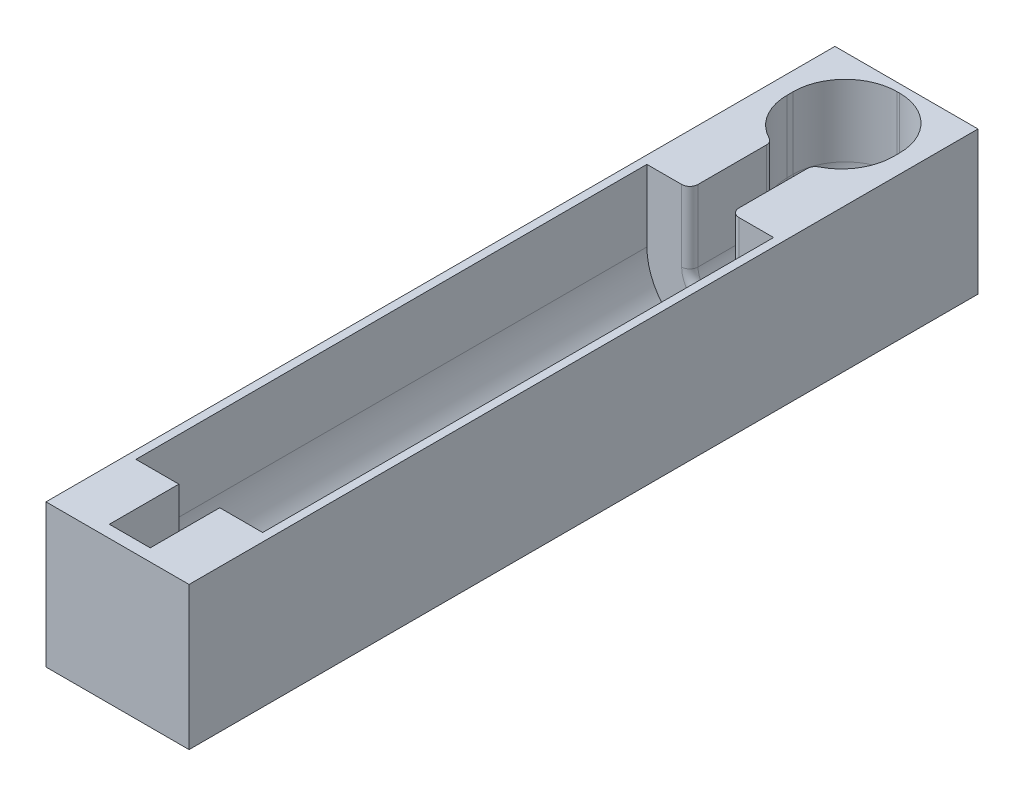
ISO-10303-21;
HEADER;
FILE_DESCRIPTION(('STEP AP214'),'2;1');
FILE_NAME('part.step','',(''),(''),'','','');
FILE_SCHEMA(('AUTOMOTIVE_DESIGN { 1 0 10303 214 1 1 1 1 }'));
ENDSEC;
DATA;
#1=APPLICATION_CONTEXT('core data for automotive mechanical design processes');
#2=APPLICATION_PROTOCOL_DEFINITION('international standard','automotive_design',2000,#1);
#3=PRODUCT_CONTEXT('',#1,'mechanical');
#4=PRODUCT('Part','Part','',(#3));
#5=PRODUCT_RELATED_PRODUCT_CATEGORY('part','',(#4));
#6=PRODUCT_DEFINITION_FORMATION('','',#4);
#7=PRODUCT_DEFINITION_CONTEXT('part definition',#1,'design');
#8=PRODUCT_DEFINITION('design','',#6,#7);
#9=PRODUCT_DEFINITION_SHAPE('','',#8);
#10=(LENGTH_UNIT() NAMED_UNIT(*) SI_UNIT(.MILLI.,.METRE.));
#11=(NAMED_UNIT(*) PLANE_ANGLE_UNIT() SI_UNIT($,.RADIAN.));
#12=(NAMED_UNIT(*) SI_UNIT($,.STERADIAN.) SOLID_ANGLE_UNIT());
#13=UNCERTAINTY_MEASURE_WITH_UNIT(LENGTH_MEASURE(1.E-05),#10,'distance_accuracy_value','');
#14=(GEOMETRIC_REPRESENTATION_CONTEXT(3) GLOBAL_UNCERTAINTY_ASSIGNED_CONTEXT((#13)) GLOBAL_UNIT_ASSIGNED_CONTEXT((#10,
#11,#12)) REPRESENTATION_CONTEXT('',''));
#15=CARTESIAN_POINT('',(0.,0.,0.));
#16=DIRECTION('',(0.,0.,1.));
#17=DIRECTION('',(1.,0.,0.));
#18=AXIS2_PLACEMENT_3D('',#15,#16,#17);
#19=CARTESIAN_POINT('',(15.5,0.,125.));
#20=DIRECTION('',(1.,0.,0.));
#21=DIRECTION('',(0.,0.,-1.));
#22=AXIS2_PLACEMENT_3D('',#19,#20,#21);
#23=PLANE('',#22);
#24=DIRECTION('',(0.,-1.,0.));
#25=VECTOR('',#24,1.);
#26=CARTESIAN_POINT('',(15.5,0.,0.));
#27=LINE('',#26,#25);
#28=CARTESIAN_POINT('',(15.5,17.5,0.));
#29=VERTEX_POINT('',#28);
#30=CARTESIAN_POINT('',(15.5,0.,0.));
#31=VERTEX_POINT('',#30);
#32=EDGE_CURVE('E326',#29,#31,#27,.T.);
#33=ORIENTED_EDGE('',*,*,#32,.T.);
#34=DIRECTION('',(0.,0.,-1.));
#35=VECTOR('',#34,1.);
#36=CARTESIAN_POINT('',(15.5,0.,125.));
#37=LINE('',#36,#35);
#38=CARTESIAN_POINT('',(15.5,0.,125.));
#39=VERTEX_POINT('',#38);
#40=EDGE_CURVE('E368',#39,#31,#37,.T.);
#41=ORIENTED_EDGE('',*,*,#40,.F.);
#42=DIRECTION('',(0.,-1.,0.));
#43=VECTOR('',#42,1.);
#44=CARTESIAN_POINT('',(15.5,0.,125.));
#45=LINE('',#44,#43);
#46=CARTESIAN_POINT('',(15.5,17.5,125.));
#47=VERTEX_POINT('',#46);
#48=EDGE_CURVE('E330',#47,#39,#45,.T.);
#49=ORIENTED_EDGE('',*,*,#48,.F.);
#50=DIRECTION('',(0.,0.,-1.));
#51=VECTOR('',#50,1.);
#52=CARTESIAN_POINT('',(15.5,17.5,125.));
#53=LINE('',#52,#51);
#54=EDGE_CURVE('E372',#47,#29,#53,.T.);
#55=ORIENTED_EDGE('',*,*,#54,.T.);
#56=EDGE_LOOP('',(#33,#41,#49,#55));
#57=FACE_BOUND('',#56,.T.);
#58=ADVANCED_FACE('F48',(#57),#23,.F.);
#59=CARTESIAN_POINT('',(0.,0.,125.));
#60=DIRECTION('',(0.,0.,-1.));
#61=DIRECTION('',(-1.,0.,0.));
#62=AXIS2_PLACEMENT_3D('',#59,#60,#61);
#63=CYLINDRICAL_SURFACE('',#62,15.5);
#64=CARTESIAN_POINT('',(0.,0.,0.));
#65=DIRECTION('',(0.,0.,-1.));
#66=DIRECTION('',(1.,0.,0.));
#67=AXIS2_PLACEMENT_3D('',#64,#65,#66);
#68=CIRCLE('',#67,15.5);
#69=CARTESIAN_POINT('',(-15.5,0.,0.));
#70=VERTEX_POINT('',#69);
#71=EDGE_CURVE('E346',#31,#70,#68,.T.);
#72=ORIENTED_EDGE('',*,*,#71,.T.);
#73=DIRECTION('',(0.,0.,-1.));
#74=VECTOR('',#73,1.);
#75=CARTESIAN_POINT('',(-15.5,0.,125.));
#76=LINE('',#75,#74);
#77=CARTESIAN_POINT('',(-15.5,0.,125.));
#78=VERTEX_POINT('',#77);
#79=EDGE_CURVE('E364',#78,#70,#76,.T.);
#80=ORIENTED_EDGE('',*,*,#79,.F.);
#81=CARTESIAN_POINT('',(0.,0.,125.));
#82=DIRECTION('',(0.,0.,-1.));
#83=DIRECTION('',(1.,0.,0.));
#84=AXIS2_PLACEMENT_3D('',#81,#82,#83);
#85=CIRCLE('',#84,15.5);
#86=EDGE_CURVE('E334',#39,#78,#85,.T.);
#87=ORIENTED_EDGE('',*,*,#86,.F.);
#88=ORIENTED_EDGE('',*,*,#40,.T.);
#89=EDGE_LOOP('',(#72,#80,#87,#88));
#90=FACE_BOUND('',#89,.T.);
#91=ADVANCED_FACE('F589',(#90),#63,.F.);
#92=CARTESIAN_POINT('',(-15.5,0.,125.));
#93=DIRECTION('',(-1.,0.,0.));
#94=DIRECTION('',(0.,0.,1.));
#95=AXIS2_PLACEMENT_3D('',#92,#93,#94);
#96=PLANE('',#95);
#97=DIRECTION('',(0.,1.,0.));
#98=VECTOR('',#97,1.);
#99=CARTESIAN_POINT('',(-15.5,0.,0.));
#100=LINE('',#99,#98);
#101=CARTESIAN_POINT('',(-15.5,17.5,0.));
#102=VERTEX_POINT('',#101);
#103=EDGE_CURVE('E335',#70,#102,#100,.T.);
#104=ORIENTED_EDGE('',*,*,#103,.T.);
#105=DIRECTION('',(0.,0.,-1.));
#106=VECTOR('',#105,1.);
#107=CARTESIAN_POINT('',(-15.5,17.5,125.));
#108=LINE('',#107,#106);
#109=CARTESIAN_POINT('',(-15.5,17.5,125.));
#110=VERTEX_POINT('',#109);
#111=EDGE_CURVE('E360',#110,#102,#108,.T.);
#112=ORIENTED_EDGE('',*,*,#111,.F.);
#113=DIRECTION('',(0.,1.,0.));
#114=VECTOR('',#113,1.);
#115=CARTESIAN_POINT('',(-15.5,0.,125.));
#116=LINE('',#115,#114);
#117=EDGE_CURVE('E339',#78,#110,#116,.T.);
#118=ORIENTED_EDGE('',*,*,#117,.F.);
#119=ORIENTED_EDGE('',*,*,#79,.T.);
#120=EDGE_LOOP('',(#104,#112,#118,#119));
#121=FACE_BOUND('',#120,.T.);
#122=ADVANCED_FACE('F587',(#121),#96,.F.);
#123=CARTESIAN_POINT('',(-17.5,17.5,125.));
#124=DIRECTION('',(0.,-1.,0.));
#125=DIRECTION('',(0.,0.,-1.));
#126=AXIS2_PLACEMENT_3D('',#123,#124,#125);
#127=PLANE('',#126);
#128=DIRECTION('',(0.,0.,1.));
#129=VECTOR('',#128,1.);
#130=CARTESIAN_POINT('',(5.,17.5,-20.));
#131=LINE('',#130,#129);
#132=CARTESIAN_POINT('',(5.,17.5,-18.7139631759652));
#133=VERTEX_POINT('',#132);
#134=CARTESIAN_POINT('',(5.,17.5,-2.));
#135=VERTEX_POINT('',#134);
#136=EDGE_CURVE('E528',#133,#135,#131,.T.);
#137=ORIENTED_EDGE('',*,*,#136,.T.);
#138=CARTESIAN_POINT('',(7.,17.5,-2.));
#139=DIRECTION('',(0.,-1.,0.));
#140=DIRECTION('',(0.,0.,-1.));
#141=AXIS2_PLACEMENT_3D('',#138,#139,#140);
#142=CIRCLE('',#141,2.);
#143=CARTESIAN_POINT('',(7.,17.5,0.));
#144=VERTEX_POINT('',#143);
#145=EDGE_CURVE('E462',#135,#144,#142,.F.);
#146=ORIENTED_EDGE('',*,*,#145,.T.);
#147=DIRECTION('',(1.,0.,0.));
#148=VECTOR('',#147,1.);
#149=CARTESIAN_POINT('',(17.5,17.5,0.));
#150=LINE('',#149,#148);
#151=EDGE_CURVE('E262',#144,#29,#150,.T.);
#152=ORIENTED_EDGE('',*,*,#151,.T.);
#153=ORIENTED_EDGE('',*,*,#54,.F.);
#154=DIRECTION('',(-1.,0.,0.));
#155=VECTOR('',#154,1.);
#156=CARTESIAN_POINT('',(-17.5,17.5,125.));
#157=LINE('',#156,#155);
#158=CARTESIAN_POINT('',(5.,17.5,125.));
#159=VERTEX_POINT('',#158);
#160=EDGE_CURVE('E317',#47,#159,#157,.T.);
#161=ORIENTED_EDGE('',*,*,#160,.T.);
#162=DIRECTION('',(0.,0.,-1.));
#163=VECTOR('',#162,1.);
#164=CARTESIAN_POINT('',(5.,17.5,142.));
#165=LINE('',#164,#163);
#166=CARTESIAN_POINT('',(5.,17.5,142.));
#167=VERTEX_POINT('',#166);
#168=EDGE_CURVE('E302',#167,#159,#165,.T.);
#169=ORIENTED_EDGE('',*,*,#168,.F.);
#170=DIRECTION('',(1.,0.,0.));
#171=VECTOR('',#170,1.);
#172=CARTESIAN_POINT('',(-5.,17.5,142.));
#173=LINE('',#172,#171);
#174=CARTESIAN_POINT('',(-5.,17.5,142.));
#175=VERTEX_POINT('',#174);
#176=EDGE_CURVE('E282',#175,#167,#173,.T.);
#177=ORIENTED_EDGE('',*,*,#176,.F.);
#178=DIRECTION('',(0.,0.,-1.));
#179=VECTOR('',#178,1.);
#180=CARTESIAN_POINT('',(-5.,17.5,142.));
#181=LINE('',#180,#179);
#182=CARTESIAN_POINT('',(-5.,17.5,125.));
#183=VERTEX_POINT('',#182);
#184=EDGE_CURVE('E305',#175,#183,#181,.T.);
#185=ORIENTED_EDGE('',*,*,#184,.T.);
#186=EDGE_CURVE('E301',#183,#110,#157,.T.);
#187=ORIENTED_EDGE('',*,*,#186,.T.);
#188=ORIENTED_EDGE('',*,*,#111,.T.);
#189=CARTESIAN_POINT('',(-7.,17.5,0.));
#190=VERTEX_POINT('',#189);
#191=EDGE_CURVE('E258',#102,#190,#150,.T.);
#192=ORIENTED_EDGE('',*,*,#191,.T.);
#193=CARTESIAN_POINT('',(-7.,17.5,-2.));
#194=DIRECTION('',(0.,-1.,0.));
#195=DIRECTION('',(0.,0.,-1.));
#196=AXIS2_PLACEMENT_3D('',#193,#194,#195);
#197=CIRCLE('',#196,2.);
#198=CARTESIAN_POINT('',(-5.,17.5,-2.));
#199=VERTEX_POINT('',#198);
#200=EDGE_CURVE('E456',#190,#199,#197,.F.);
#201=ORIENTED_EDGE('',*,*,#200,.T.);
#202=DIRECTION('',(0.,0.,1.));
#203=VECTOR('',#202,1.);
#204=CARTESIAN_POINT('',(-5.,17.5,-20.));
#205=LINE('',#204,#203);
#206=CARTESIAN_POINT('',(-5.,17.5,-18.7139631759652));
#207=VERTEX_POINT('',#206);
#208=EDGE_CURVE('E518',#207,#199,#205,.T.);
#209=ORIENTED_EDGE('',*,*,#208,.F.);
#210=CARTESIAN_POINT('',(-7.,17.5,-18.7139631759652));
#211=DIRECTION('',(0.,-1.,0.));
#212=DIRECTION('',(0.,0.,-1.));
#213=AXIS2_PLACEMENT_3D('',#210,#211,#212);
#214=CIRCLE('',#213,2.);
#215=CARTESIAN_POINT('',(-6.08843537414966,17.5,-20.4941457320246));
#216=VERTEX_POINT('',#215);
#217=EDGE_CURVE('E453',#207,#216,#214,.F.);
#218=ORIENTED_EDGE('',*,*,#217,.T.);
#219=CARTESIAN_POINT('',(-0.300000000000006,17.5,-31.7983049630021));
#220=DIRECTION('',(0.,-1.,0.));
#221=DIRECTION('',(0.,0.,-1.));
#222=AXIS2_PLACEMENT_3D('',#219,#220,#221);
#223=CIRCLE('',#222,12.7);
#224=CARTESIAN_POINT('',(-13.,17.5,-31.7983049630021));
#225=VERTEX_POINT('',#224);
#226=EDGE_CURVE('E424',#216,#225,#223,.T.);
#227=ORIENTED_EDGE('',*,*,#226,.T.);
#228=DIRECTION('',(0.,0.,-1.));
#229=VECTOR('',#228,1.);
#230=CARTESIAN_POINT('',(-13.,17.5,125.));
#231=LINE('',#230,#229);
#232=CARTESIAN_POINT('',(-13.,17.5,-33.3));
#233=VERTEX_POINT('',#232);
#234=EDGE_CURVE('E376',#225,#233,#231,.T.);
#235=ORIENTED_EDGE('',*,*,#234,.T.);
#236=CARTESIAN_POINT('',(-0.300000000000003,17.5,-33.3));
#237=DIRECTION('',(0.,-1.,0.));
#238=DIRECTION('',(0.,0.,-1.));
#239=AXIS2_PLACEMENT_3D('',#236,#237,#238);
#240=CIRCLE('',#239,12.7);
#241=CARTESIAN_POINT('',(-0.300000000000002,17.5,-46.));
#242=VERTEX_POINT('',#241);
#243=EDGE_CURVE('E427',#233,#242,#240,.T.);
#244=ORIENTED_EDGE('',*,*,#243,.T.);
#245=DIRECTION('',(-1.,0.,0.));
#246=VECTOR('',#245,1.);
#247=CARTESIAN_POINT('',(-17.5,17.5,-46.));
#248=LINE('',#247,#246);
#249=CARTESIAN_POINT('',(0.300000000000002,17.5,-46.));
#250=VERTEX_POINT('',#249);
#251=EDGE_CURVE('E380',#250,#242,#248,.T.);
#252=ORIENTED_EDGE('',*,*,#251,.F.);
#253=CARTESIAN_POINT('',(0.300000000000003,17.5,-33.3));
#254=DIRECTION('',(0.,-1.,0.));
#255=DIRECTION('',(0.,0.,-1.));
#256=AXIS2_PLACEMENT_3D('',#253,#254,#255);
#257=CIRCLE('',#256,12.7);
#258=CARTESIAN_POINT('',(13.,17.5,-33.3));
#259=VERTEX_POINT('',#258);
#260=EDGE_CURVE('E421',#250,#259,#257,.T.);
#261=ORIENTED_EDGE('',*,*,#260,.T.);
#262=DIRECTION('',(0.,0.,1.));
#263=VECTOR('',#262,1.);
#264=CARTESIAN_POINT('',(13.,17.5,125.));
#265=LINE('',#264,#263);
#266=CARTESIAN_POINT('',(13.,17.5,-31.7983049630021));
#267=VERTEX_POINT('',#266);
#268=EDGE_CURVE('E384',#259,#267,#265,.T.);
#269=ORIENTED_EDGE('',*,*,#268,.T.);
#270=CARTESIAN_POINT('',(0.300000000000006,17.5,-31.7983049630021));
#271=DIRECTION('',(0.,-1.,0.));
#272=DIRECTION('',(0.,0.,-1.));
#273=AXIS2_PLACEMENT_3D('',#270,#271,#272);
#274=CIRCLE('',#273,12.7);
#275=CARTESIAN_POINT('',(6.08843537414966,17.5,-20.4941457320246));
#276=VERTEX_POINT('',#275);
#277=EDGE_CURVE('E417',#267,#276,#274,.T.);
#278=ORIENTED_EDGE('',*,*,#277,.T.);
#279=CARTESIAN_POINT('',(7.,17.5,-18.7139631759652));
#280=DIRECTION('',(0.,-1.,0.));
#281=DIRECTION('',(0.,0.,-1.));
#282=AXIS2_PLACEMENT_3D('',#279,#280,#281);
#283=CIRCLE('',#282,2.);
#284=EDGE_CURVE('E459',#276,#133,#283,.F.);
#285=ORIENTED_EDGE('',*,*,#284,.T.);
#286=EDGE_LOOP('',(#137,#146,#152,#153,#161,#169,#177,#185,#187,#188,#192,#201,#209,#218,#227,
#235,#244,#252,#261,#269,#278,#285));
#287=FACE_BOUND('',#286,.T.);
#288=DIRECTION('',(0.,0.,-1.));
#289=VECTOR('',#288,1.);
#290=CARTESIAN_POINT('',(17.5,17.5,125.));
#291=LINE('',#290,#289);
#292=CARTESIAN_POINT('',(17.5,17.5,145.));
#293=VERTEX_POINT('',#292);
#294=CARTESIAN_POINT('',(17.5,17.5,-48.));
#295=VERTEX_POINT('',#294);
#296=EDGE_CURVE('E242',#293,#295,#291,.T.);
#297=ORIENTED_EDGE('',*,*,#296,.T.);
#298=DIRECTION('',(1.,0.,0.));
#299=VECTOR('',#298,1.);
#300=CARTESIAN_POINT('',(17.5,17.5,-48.));
#301=LINE('',#300,#299);
#302=CARTESIAN_POINT('',(-17.5,17.5,-48.));
#303=VERTEX_POINT('',#302);
#304=EDGE_CURVE('E256',#303,#295,#301,.T.);
#305=ORIENTED_EDGE('',*,*,#304,.F.);
#306=DIRECTION('',(0.,0.,-1.));
#307=VECTOR('',#306,1.);
#308=CARTESIAN_POINT('',(-17.5,17.5,125.));
#309=LINE('',#308,#307);
#310=CARTESIAN_POINT('',(-17.5,17.5,145.));
#311=VERTEX_POINT('',#310);
#312=EDGE_CURVE('E357',#311,#303,#309,.T.);
#313=ORIENTED_EDGE('',*,*,#312,.F.);
#314=DIRECTION('',(-1.,0.,0.));
#315=VECTOR('',#314,1.);
#316=CARTESIAN_POINT('',(-17.5,17.5,145.));
#317=LINE('',#316,#315);
#318=EDGE_CURVE('E322',#293,#311,#317,.T.);
#319=ORIENTED_EDGE('',*,*,#318,.F.);
#320=EDGE_LOOP('',(#297,#305,#313,#319));
#321=FACE_BOUND('',#320,.T.);
#322=ADVANCED_FACE('F524',(#287,#321),#127,.F.);
#323=CARTESIAN_POINT('',(-17.5,-17.5,125.));
#324=DIRECTION('',(1.,0.,0.));
#325=DIRECTION('',(0.,0.,-1.));
#326=AXIS2_PLACEMENT_3D('',#323,#324,#325);
#327=PLANE('',#326);
#328=ORIENTED_EDGE('',*,*,#312,.T.);
#329=DIRECTION('',(0.,1.,0.));
#330=VECTOR('',#329,1.);
#331=CARTESIAN_POINT('',(-17.5,17.5,-48.));
#332=LINE('',#331,#330);
#333=CARTESIAN_POINT('',(-17.5,-17.5,-48.));
#334=VERTEX_POINT('',#333);
#335=EDGE_CURVE('E251',#334,#303,#332,.T.);
#336=ORIENTED_EDGE('',*,*,#335,.F.);
#337=DIRECTION('',(0.,0.,-1.));
#338=VECTOR('',#337,1.);
#339=CARTESIAN_POINT('',(-17.5,-17.5,125.));
#340=LINE('',#339,#338);
#341=CARTESIAN_POINT('',(-17.5,-17.5,145.));
#342=VERTEX_POINT('',#341);
#343=EDGE_CURVE('E241',#342,#334,#340,.T.);
#344=ORIENTED_EDGE('',*,*,#343,.F.);
#345=DIRECTION('',(0.,-1.,0.));
#346=VECTOR('',#345,1.);
#347=CARTESIAN_POINT('',(-17.5,17.5,145.));
#348=LINE('',#347,#346);
#349=EDGE_CURVE('E312',#311,#342,#348,.T.);
#350=ORIENTED_EDGE('',*,*,#349,.F.);
#351=EDGE_LOOP('',(#328,#336,#344,#350));
#352=FACE_BOUND('',#351,.T.);
#353=ADVANCED_FACE('F815',(#352),#327,.F.);
#354=CARTESIAN_POINT('',(0.,-17.5,125.));
#355=DIRECTION('',(0.,1.,0.));
#356=DIRECTION('',(0.,0.,1.));
#357=AXIS2_PLACEMENT_3D('',#354,#355,#356);
#358=PLANE('',#357);
#359=ORIENTED_EDGE('',*,*,#343,.T.);
#360=DIRECTION('',(-1.,0.,0.));
#361=VECTOR('',#360,1.);
#362=CARTESIAN_POINT('',(17.5,-17.5,-48.));
#363=LINE('',#362,#361);
#364=CARTESIAN_POINT('',(17.5,-17.5,-48.));
#365=VERTEX_POINT('',#364);
#366=EDGE_CURVE('E245',#365,#334,#363,.T.);
#367=ORIENTED_EDGE('',*,*,#366,.F.);
#368=DIRECTION('',(0.,0.,-1.));
#369=VECTOR('',#368,1.);
#370=CARTESIAN_POINT('',(17.5,-17.5,125.));
#371=LINE('',#370,#369);
#372=CARTESIAN_POINT('',(17.5,-17.5,145.));
#373=VERTEX_POINT('',#372);
#374=EDGE_CURVE('E230',#373,#365,#371,.T.);
#375=ORIENTED_EDGE('',*,*,#374,.F.);
#376=DIRECTION('',(1.,0.,0.));
#377=VECTOR('',#376,1.);
#378=CARTESIAN_POINT('',(-17.5,-17.5,145.));
#379=LINE('',#378,#377);
#380=EDGE_CURVE('E316',#342,#373,#379,.T.);
#381=ORIENTED_EDGE('',*,*,#380,.F.);
#382=EDGE_LOOP('',(#359,#367,#375,#381));
#383=FACE_BOUND('',#382,.T.);
#384=ADVANCED_FACE('F246',(#383),#358,.F.);
#385=CARTESIAN_POINT('',(17.5,0.,125.));
#386=DIRECTION('',(-1.,0.,0.));
#387=DIRECTION('',(0.,0.,1.));
#388=AXIS2_PLACEMENT_3D('',#385,#386,#387);
#389=PLANE('',#388);
#390=ORIENTED_EDGE('',*,*,#374,.T.);
#391=DIRECTION('',(0.,-1.,0.));
#392=VECTOR('',#391,1.);
#393=CARTESIAN_POINT('',(17.5,17.5,-48.));
#394=LINE('',#393,#392);
#395=EDGE_CURVE('E234',#295,#365,#394,.T.);
#396=ORIENTED_EDGE('',*,*,#395,.F.);
#397=ORIENTED_EDGE('',*,*,#296,.F.);
#398=DIRECTION('',(0.,1.,0.));
#399=VECTOR('',#398,1.);
#400=CARTESIAN_POINT('',(17.5,17.5,145.));
#401=LINE('',#400,#399);
#402=EDGE_CURVE('E236',#373,#293,#401,.T.);
#403=ORIENTED_EDGE('',*,*,#402,.F.);
#404=EDGE_LOOP('',(#390,#396,#397,#403));
#405=FACE_BOUND('',#404,.T.);
#406=ADVANCED_FACE('F232',(#405),#389,.F.);
#407=CARTESIAN_POINT('',(0.,0.,125.));
#408=DIRECTION('',(0.,0.,1.));
#409=DIRECTION('',(1.,0.,0.));
#410=AXIS2_PLACEMENT_3D('',#407,#408,#409);
#411=PLANE('',#410);
#412=CARTESIAN_POINT('',(0.,0.,125.));
#413=DIRECTION('',(0.,0.,-1.));
#414=DIRECTION('',(-1.,0.,0.));
#415=AXIS2_PLACEMENT_3D('',#412,#413,#414);
#416=CIRCLE('',#415,5.);
#417=CARTESIAN_POINT('',(5.,0.,125.));
#418=VERTEX_POINT('',#417);
#419=CARTESIAN_POINT('',(-5.,0.,125.));
#420=VERTEX_POINT('',#419);
#421=EDGE_CURVE('E271',#418,#420,#416,.T.);
#422=ORIENTED_EDGE('',*,*,#421,.F.);
#423=DIRECTION('',(0.,-1.,0.));
#424=VECTOR('',#423,1.);
#425=CARTESIAN_POINT('',(5.,0.,125.));
#426=LINE('',#425,#424);
#427=EDGE_CURVE('E278',#159,#418,#426,.T.);
#428=ORIENTED_EDGE('',*,*,#427,.F.);
#429=ORIENTED_EDGE('',*,*,#160,.F.);
#430=ORIENTED_EDGE('',*,*,#48,.T.);
#431=ORIENTED_EDGE('',*,*,#86,.T.);
#432=ORIENTED_EDGE('',*,*,#117,.T.);
#433=ORIENTED_EDGE('',*,*,#186,.F.);
#434=DIRECTION('',(0.,1.,0.));
#435=VECTOR('',#434,1.);
#436=CARTESIAN_POINT('',(-5.,0.,125.));
#437=LINE('',#436,#435);
#438=EDGE_CURVE('E292',#420,#183,#437,.T.);
#439=ORIENTED_EDGE('',*,*,#438,.F.);
#440=EDGE_LOOP('',(#422,#428,#429,#430,#431,#432,#433,#439));
#441=FACE_BOUND('',#440,.T.);
#442=ADVANCED_FACE('F570',(#441),#411,.F.);
#443=CARTESIAN_POINT('',(0.,0.,145.));
#444=DIRECTION('',(0.,0.,1.));
#445=DIRECTION('',(1.,0.,0.));
#446=AXIS2_PLACEMENT_3D('',#443,#444,#445);
#447=PLANE('',#446);
#448=ORIENTED_EDGE('',*,*,#349,.T.);
#449=ORIENTED_EDGE('',*,*,#380,.T.);
#450=ORIENTED_EDGE('',*,*,#402,.T.);
#451=ORIENTED_EDGE('',*,*,#318,.T.);
#452=EDGE_LOOP('',(#448,#449,#450,#451));
#453=FACE_BOUND('',#452,.T.);
#454=ADVANCED_FACE('F789',(#453),#447,.T.);
#455=CARTESIAN_POINT('',(0.,0.,142.));
#456=DIRECTION('',(0.,0.,-1.));
#457=DIRECTION('',(-1.,0.,0.));
#458=AXIS2_PLACEMENT_3D('',#455,#456,#457);
#459=CYLINDRICAL_SURFACE('',#458,5.);
#460=ORIENTED_EDGE('',*,*,#421,.T.);
#461=DIRECTION('',(0.,0.,-1.));
#462=VECTOR('',#461,1.);
#463=CARTESIAN_POINT('',(-5.,0.,142.));
#464=LINE('',#463,#462);
#465=CARTESIAN_POINT('',(-5.,0.,142.));
#466=VERTEX_POINT('',#465);
#467=EDGE_CURVE('E289',#466,#420,#464,.T.);
#468=ORIENTED_EDGE('',*,*,#467,.F.);
#469=CARTESIAN_POINT('',(0.,0.,142.));
#470=DIRECTION('',(0.,0.,-1.));
#471=DIRECTION('',(-1.,0.,0.));
#472=AXIS2_PLACEMENT_3D('',#469,#470,#471);
#473=CIRCLE('',#472,5.);
#474=CARTESIAN_POINT('',(5.,0.,142.));
#475=VERTEX_POINT('',#474);
#476=EDGE_CURVE('E273',#475,#466,#473,.T.);
#477=ORIENTED_EDGE('',*,*,#476,.F.);
#478=DIRECTION('',(0.,0.,-1.));
#479=VECTOR('',#478,1.);
#480=CARTESIAN_POINT('',(5.,0.,142.));
#481=LINE('',#480,#479);
#482=EDGE_CURVE('E298',#475,#418,#481,.T.);
#483=ORIENTED_EDGE('',*,*,#482,.T.);
#484=EDGE_LOOP('',(#460,#468,#477,#483));
#485=FACE_BOUND('',#484,.T.);
#486=ADVANCED_FACE('F782',(#485),#459,.F.);
#487=CARTESIAN_POINT('',(5.,0.,142.));
#488=DIRECTION('',(1.,0.,0.));
#489=DIRECTION('',(0.,1.,0.));
#490=AXIS2_PLACEMENT_3D('',#487,#488,#489);
#491=PLANE('',#490);
#492=ORIENTED_EDGE('',*,*,#427,.T.);
#493=ORIENTED_EDGE('',*,*,#482,.F.);
#494=DIRECTION('',(0.,-1.,0.));
#495=VECTOR('',#494,1.);
#496=CARTESIAN_POINT('',(5.,0.,142.));
#497=LINE('',#496,#495);
#498=EDGE_CURVE('E285',#167,#475,#497,.T.);
#499=ORIENTED_EDGE('',*,*,#498,.F.);
#500=ORIENTED_EDGE('',*,*,#168,.T.);
#501=EDGE_LOOP('',(#492,#493,#499,#500));
#502=FACE_BOUND('',#501,.T.);
#503=ADVANCED_FACE('F573',(#502),#491,.F.);
#504=CARTESIAN_POINT('',(-5.,0.,142.));
#505=DIRECTION('',(-1.,0.,0.));
#506=DIRECTION('',(0.,-1.,0.));
#507=AXIS2_PLACEMENT_3D('',#504,#505,#506);
#508=PLANE('',#507);
#509=ORIENTED_EDGE('',*,*,#438,.T.);
#510=ORIENTED_EDGE('',*,*,#184,.F.);
#511=DIRECTION('',(0.,1.,0.));
#512=VECTOR('',#511,1.);
#513=CARTESIAN_POINT('',(-5.,0.,142.));
#514=LINE('',#513,#512);
#515=EDGE_CURVE('E277',#466,#175,#514,.T.);
#516=ORIENTED_EDGE('',*,*,#515,.F.);
#517=ORIENTED_EDGE('',*,*,#467,.T.);
#518=EDGE_LOOP('',(#509,#510,#516,#517));
#519=FACE_BOUND('',#518,.T.);
#520=ADVANCED_FACE('F582',(#519),#508,.F.);
#521=CARTESIAN_POINT('',(0.,0.,142.));
#522=DIRECTION('',(0.,0.,-1.));
#523=DIRECTION('',(-1.,0.,0.));
#524=AXIS2_PLACEMENT_3D('',#521,#522,#523);
#525=PLANE('',#524);
#526=ORIENTED_EDGE('',*,*,#476,.T.);
#527=ORIENTED_EDGE('',*,*,#515,.T.);
#528=ORIENTED_EDGE('',*,*,#176,.T.);
#529=ORIENTED_EDGE('',*,*,#498,.T.);
#530=EDGE_LOOP('',(#526,#527,#528,#529));
#531=FACE_BOUND('',#530,.T.);
#532=ADVANCED_FACE('F579',(#531),#525,.T.);
#533=CARTESIAN_POINT('',(0.,0.,-48.));
#534=DIRECTION('',(0.,0.,-1.));
#535=DIRECTION('',(-1.,0.,0.));
#536=AXIS2_PLACEMENT_3D('',#533,#534,#535);
#537=PLANE('',#536);
#538=ORIENTED_EDGE('',*,*,#395,.T.);
#539=ORIENTED_EDGE('',*,*,#366,.T.);
#540=ORIENTED_EDGE('',*,*,#335,.T.);
#541=ORIENTED_EDGE('',*,*,#304,.T.);
#542=EDGE_LOOP('',(#538,#539,#540,#541));
#543=FACE_BOUND('',#542,.T.);
#544=ADVANCED_FACE('F254',(#543),#537,.T.);
#545=CARTESIAN_POINT('',(0.,0.,0.));
#546=DIRECTION('',(0.,0.,-1.));
#547=DIRECTION('',(-1.,0.,0.));
#548=AXIS2_PLACEMENT_3D('',#545,#546,#547);
#549=PLANE('',#548);
#550=ORIENTED_EDGE('',*,*,#151,.F.);
#551=DIRECTION('',(0.,1.,0.));
#552=VECTOR('',#551,1.);
#553=CARTESIAN_POINT('',(7.,0.,0.));
#554=LINE('',#553,#552);
#555=CARTESIAN_POINT('',(7.,0.,0.));
#556=VERTEX_POINT('',#555);
#557=EDGE_CURVE('E471',#144,#556,#554,.F.);
#558=ORIENTED_EDGE('',*,*,#557,.T.);
#559=CARTESIAN_POINT('',(0.,0.,0.));
#560=DIRECTION('',(0.,0.,-1.));
#561=DIRECTION('',(-1.,0.,0.));
#562=AXIS2_PLACEMENT_3D('',#559,#560,#561);
#563=CIRCLE('',#562,7.);
#564=CARTESIAN_POINT('',(-7.,0.,0.));
#565=VERTEX_POINT('',#564);
#566=EDGE_CURVE('E468',#556,#565,#563,.T.);
#567=ORIENTED_EDGE('',*,*,#566,.T.);
#568=DIRECTION('',(0.,-1.,0.));
#569=VECTOR('',#568,1.);
#570=CARTESIAN_POINT('',(-7.,0.,0.));
#571=LINE('',#570,#569);
#572=EDGE_CURVE('E465',#565,#190,#571,.F.);
#573=ORIENTED_EDGE('',*,*,#572,.T.);
#574=ORIENTED_EDGE('',*,*,#191,.F.);
#575=ORIENTED_EDGE('',*,*,#103,.F.);
#576=ORIENTED_EDGE('',*,*,#71,.F.);
#577=ORIENTED_EDGE('',*,*,#32,.F.);
#578=EDGE_LOOP('',(#550,#558,#567,#573,#574,#575,#576,#577));
#579=FACE_BOUND('',#578,.T.);
#580=ADVANCED_FACE('F562',(#579),#549,.F.);
#581=CARTESIAN_POINT('',(0.,0.,-20.));
#582=DIRECTION('',(0.,0.,1.));
#583=DIRECTION('',(1.,0.,0.));
#584=AXIS2_PLACEMENT_3D('',#581,#582,#583);
#585=CYLINDRICAL_SURFACE('',#584,5.);
#586=DIRECTION('',(0.,0.,1.));
#587=VECTOR('',#586,1.);
#588=CARTESIAN_POINT('',(-5.,0.,-20.));
#589=LINE('',#588,#587);
#590=CARTESIAN_POINT('',(-5.,0.,-18.7139631759652));
#591=VERTEX_POINT('',#590);
#592=CARTESIAN_POINT('',(-5.,0.,-2.));
#593=VERTEX_POINT('',#592);
#594=EDGE_CURVE('E521',#591,#593,#589,.T.);
#595=ORIENTED_EDGE('',*,*,#594,.T.);
#596=CARTESIAN_POINT('',(0.,0.,-2.));
#597=DIRECTION('',(0.,0.,-1.));
#598=DIRECTION('',(-1.,0.,0.));
#599=AXIS2_PLACEMENT_3D('',#596,#597,#598);
#600=CIRCLE('',#599,5.);
#601=CARTESIAN_POINT('',(5.,0.,-2.));
#602=VERTEX_POINT('',#601);
#603=EDGE_CURVE('E477',#593,#602,#600,.F.);
#604=ORIENTED_EDGE('',*,*,#603,.T.);
#605=DIRECTION('',(0.,0.,1.));
#606=VECTOR('',#605,1.);
#607=CARTESIAN_POINT('',(5.,0.,-20.));
#608=LINE('',#607,#606);
#609=CARTESIAN_POINT('',(5.,0.,-18.7139631759652));
#610=VERTEX_POINT('',#609);
#611=EDGE_CURVE('E265',#610,#602,#608,.T.);
#612=ORIENTED_EDGE('',*,*,#611,.F.);
#613=CARTESIAN_POINT('',(0.,0.,-18.7139631759652));
#614=DIRECTION('',(0.,0.,-1.));
#615=DIRECTION('',(-1.,0.,0.));
#616=AXIS2_PLACEMENT_3D('',#613,#614,#615);
#617=CIRCLE('',#616,5.);
#618=EDGE_CURVE('E474',#610,#591,#617,.T.);
#619=ORIENTED_EDGE('',*,*,#618,.T.);
#620=EDGE_LOOP('',(#595,#604,#612,#619));
#621=FACE_BOUND('',#620,.T.);
#622=ADVANCED_FACE('F736',(#621),#585,.F.);
#623=CARTESIAN_POINT('',(-5.,0.,-20.));
#624=DIRECTION('',(-1.,0.,0.));
#625=DIRECTION('',(0.,-1.,0.));
#626=AXIS2_PLACEMENT_3D('',#623,#624,#625);
#627=PLANE('',#626);
#628=ORIENTED_EDGE('',*,*,#208,.T.);
#629=DIRECTION('',(0.,-1.,0.));
#630=VECTOR('',#629,1.);
#631=CARTESIAN_POINT('',(-5.,0.,-2.));
#632=LINE('',#631,#630);
#633=EDGE_CURVE('E58',#199,#593,#632,.T.);
#634=ORIENTED_EDGE('',*,*,#633,.T.);
#635=ORIENTED_EDGE('',*,*,#594,.F.);
#636=DIRECTION('',(0.,-1.,0.));
#637=VECTOR('',#636,1.);
#638=CARTESIAN_POINT('',(-5.,0.,-18.7139631759652));
#639=LINE('',#638,#637);
#640=EDGE_CURVE('E486',#591,#207,#639,.F.);
#641=ORIENTED_EDGE('',*,*,#640,.T.);
#642=EDGE_LOOP('',(#628,#634,#635,#641));
#643=FACE_BOUND('',#642,.T.);
#644=ADVANCED_FACE('F517',(#643),#627,.F.);
#645=CARTESIAN_POINT('',(5.,0.,-20.));
#646=DIRECTION('',(1.,0.,0.));
#647=DIRECTION('',(0.,1.,0.));
#648=AXIS2_PLACEMENT_3D('',#645,#646,#647);
#649=PLANE('',#648);
#650=ORIENTED_EDGE('',*,*,#611,.T.);
#651=DIRECTION('',(0.,1.,0.));
#652=VECTOR('',#651,1.);
#653=CARTESIAN_POINT('',(5.,0.,-2.));
#654=LINE('',#653,#652);
#655=EDGE_CURVE('E449',#602,#135,#654,.T.);
#656=ORIENTED_EDGE('',*,*,#655,.T.);
#657=ORIENTED_EDGE('',*,*,#136,.F.);
#658=DIRECTION('',(0.,1.,0.));
#659=VECTOR('',#658,1.);
#660=CARTESIAN_POINT('',(5.,0.,-18.7139631759652));
#661=LINE('',#660,#659);
#662=EDGE_CURVE('E430',#133,#610,#661,.F.);
#663=ORIENTED_EDGE('',*,*,#662,.T.);
#664=EDGE_LOOP('',(#650,#656,#657,#663));
#665=FACE_BOUND('',#664,.T.);
#666=ADVANCED_FACE('F547',(#665),#649,.F.);
#667=CARTESIAN_POINT('',(-13.,0.,-46.));
#668=DIRECTION('',(-1.,0.,0.));
#669=DIRECTION('',(0.,0.,1.));
#670=AXIS2_PLACEMENT_3D('',#667,#668,#669);
#671=PLANE('',#670);
#672=ORIENTED_EDGE('',*,*,#234,.F.);
#673=DIRECTION('',(0.,-1.,0.));
#674=VECTOR('',#673,1.);
#675=CARTESIAN_POINT('',(-13.,0.,-31.7983049630021));
#676=LINE('',#675,#674);
#677=CARTESIAN_POINT('',(-13.,0.,-31.7983049630021));
#678=VERTEX_POINT('',#677);
#679=EDGE_CURVE('E414',#225,#678,#676,.T.);
#680=ORIENTED_EDGE('',*,*,#679,.T.);
#681=DIRECTION('',(0.,0.,1.));
#682=VECTOR('',#681,1.);
#683=CARTESIAN_POINT('',(-13.,0.,-46.));
#684=LINE('',#683,#682);
#685=CARTESIAN_POINT('',(-13.,0.,-33.3));
#686=VERTEX_POINT('',#685);
#687=EDGE_CURVE('E537',#686,#678,#684,.T.);
#688=ORIENTED_EDGE('',*,*,#687,.F.);
#689=DIRECTION('',(0.,-1.,0.));
#690=VECTOR('',#689,1.);
#691=CARTESIAN_POINT('',(-13.,0.,-33.3));
#692=LINE('',#691,#690);
#693=EDGE_CURVE('E411',#686,#233,#692,.F.);
#694=ORIENTED_EDGE('',*,*,#693,.T.);
#695=EDGE_LOOP('',(#672,#680,#688,#694));
#696=FACE_BOUND('',#695,.T.);
#697=ADVANCED_FACE('F706',(#696),#671,.F.);
#698=CARTESIAN_POINT('',(13.,0.,-46.));
#699=DIRECTION('',(1.,0.,0.));
#700=DIRECTION('',(0.,0.,-1.));
#701=AXIS2_PLACEMENT_3D('',#698,#699,#700);
#702=PLANE('',#701);
#703=DIRECTION('',(0.,0.,1.));
#704=VECTOR('',#703,1.);
#705=CARTESIAN_POINT('',(13.,0.,-46.));
#706=LINE('',#705,#704);
#707=CARTESIAN_POINT('',(13.,0.,-33.3));
#708=VERTEX_POINT('',#707);
#709=CARTESIAN_POINT('',(13.,0.,-31.7983049630018));
#710=VERTEX_POINT('',#709);
#711=EDGE_CURVE('E438',#708,#710,#706,.T.);
#712=ORIENTED_EDGE('',*,*,#711,.T.);
#713=DIRECTION('',(0.,1.,0.));
#714=VECTOR('',#713,1.);
#715=CARTESIAN_POINT('',(13.,0.,-31.7983049630021));
#716=LINE('',#715,#714);
#717=EDGE_CURVE('E391',#710,#267,#716,.T.);
#718=ORIENTED_EDGE('',*,*,#717,.T.);
#719=ORIENTED_EDGE('',*,*,#268,.F.);
#720=DIRECTION('',(0.,1.,0.));
#721=VECTOR('',#720,1.);
#722=CARTESIAN_POINT('',(13.,0.,-33.3));
#723=LINE('',#722,#721);
#724=EDGE_CURVE('E388',#259,#708,#723,.F.);
#725=ORIENTED_EDGE('',*,*,#724,.T.);
#726=EDGE_LOOP('',(#712,#718,#719,#725));
#727=FACE_BOUND('',#726,.T.);
#728=ADVANCED_FACE('F695',(#727),#702,.F.);
#729=CARTESIAN_POINT('',(0.,0.,-46.));
#730=DIRECTION('',(0.,0.,1.));
#731=DIRECTION('',(1.,0.,0.));
#732=AXIS2_PLACEMENT_3D('',#729,#730,#731);
#733=PLANE('',#732);
#734=CARTESIAN_POINT('',(0.,0.,-46.));
#735=DIRECTION('',(0.,0.,1.));
#736=DIRECTION('',(1.,0.,0.));
#737=AXIS2_PLACEMENT_3D('',#734,#735,#736);
#738=CIRCLE('',#737,0.300000000000002);
#739=CARTESIAN_POINT('',(-0.300000000000003,0.,-46.));
#740=VERTEX_POINT('',#739);
#741=CARTESIAN_POINT('',(0.300000000000002,0.,-46.));
#742=VERTEX_POINT('',#741);
#743=EDGE_CURVE('E404',#740,#742,#738,.T.);
#744=ORIENTED_EDGE('',*,*,#743,.T.);
#745=DIRECTION('',(0.,1.,0.));
#746=VECTOR('',#745,1.);
#747=CARTESIAN_POINT('',(0.300000000000003,0.,-46.));
#748=LINE('',#747,#746);
#749=EDGE_CURVE('E407',#742,#250,#748,.T.);
#750=ORIENTED_EDGE('',*,*,#749,.T.);
#751=ORIENTED_EDGE('',*,*,#251,.T.);
#752=DIRECTION('',(0.,-1.,0.));
#753=VECTOR('',#752,1.);
#754=CARTESIAN_POINT('',(-0.300000000000003,0.,-46.));
#755=LINE('',#754,#753);
#756=EDGE_CURVE('E401',#242,#740,#755,.T.);
#757=ORIENTED_EDGE('',*,*,#756,.T.);
#758=EDGE_LOOP('',(#744,#750,#751,#757));
#759=FACE_BOUND('',#758,.T.);
#760=ADVANCED_FACE('F685',(#759),#733,.T.);
#761=CARTESIAN_POINT('',(0.,0.,-46.));
#762=DIRECTION('',(0.,0.,1.));
#763=DIRECTION('',(1.,0.,0.));
#764=AXIS2_PLACEMENT_3D('',#761,#762,#763);
#765=CYLINDRICAL_SURFACE('',#764,13.);
#766=ORIENTED_EDGE('',*,*,#687,.T.);
#767=CARTESIAN_POINT('',(0.,0.,-31.7983049630018));
#768=DIRECTION('',(0.,0.,1.));
#769=DIRECTION('',(1.,0.,0.));
#770=AXIS2_PLACEMENT_3D('',#767,#768,#769);
#771=CIRCLE('',#770,13.);
#772=EDGE_CURVE('E398',#678,#710,#771,.T.);
#773=ORIENTED_EDGE('',*,*,#772,.T.);
#774=ORIENTED_EDGE('',*,*,#711,.F.);
#775=CARTESIAN_POINT('',(0.,0.,-33.3));
#776=DIRECTION('',(0.,0.,1.));
#777=DIRECTION('',(1.,0.,0.));
#778=AXIS2_PLACEMENT_3D('',#775,#776,#777);
#779=CIRCLE('',#778,13.);
#780=EDGE_CURVE('E395',#708,#686,#779,.F.);
#781=ORIENTED_EDGE('',*,*,#780,.T.);
#782=EDGE_LOOP('',(#766,#773,#774,#781));
#783=FACE_BOUND('',#782,.T.);
#784=ADVANCED_FACE('F612',(#783),#765,.F.);
#785=CARTESIAN_POINT('',(-0.300000000000005,0.,-31.7983049630021));
#786=DIRECTION('',(0.,-1.,0.));
#787=DIRECTION('',(1.,0.,0.));
#788=AXIS2_PLACEMENT_3D('',#785,#786,#787);
#789=CYLINDRICAL_SURFACE('',#788,12.7);
#790=ORIENTED_EDGE('',*,*,#226,.F.);
#791=DIRECTION('',(0.,-1.,0.));
#792=VECTOR('',#791,1.);
#793=CARTESIAN_POINT('',(-6.08843537414966,0.,-20.4941457320246));
#794=LINE('',#793,#792);
#795=CARTESIAN_POINT('',(-6.08843537414966,0.,-20.4941457320246));
#796=VERTEX_POINT('',#795);
#797=EDGE_CURVE('E11',#216,#796,#794,.T.);
#798=ORIENTED_EDGE('',*,*,#797,.T.);
#799=CARTESIAN_POINT('',(-0.300000000000003,0.,-31.7983049630021));
#800=DIRECTION('',(0.,1.,0.));
#801=DIRECTION('',(-1.,0.,0.));
#802=AXIS2_PLACEMENT_3D('',#799,#800,#801);
#803=CIRCLE('',#802,12.7);
#804=EDGE_CURVE('E434',#678,#796,#803,.T.);
#805=ORIENTED_EDGE('',*,*,#804,.F.);
#806=ORIENTED_EDGE('',*,*,#679,.F.);
#807=EDGE_LOOP('',(#790,#798,#805,#806));
#808=FACE_BOUND('',#807,.T.);
#809=ADVANCED_FACE('F609',(#808),#789,.F.);
#810=CARTESIAN_POINT('',(0.,0.,-31.7983049630021));
#811=DIRECTION('',(0.,0.,1.));
#812=DIRECTION('',(1.,0.,0.));
#813=AXIS2_PLACEMENT_3D('',#810,#811,#812);
#814=DEGENERATE_TOROIDAL_SURFACE('',#813,0.300000000000002,12.7,.T.);
#815=ORIENTED_EDGE('',*,*,#804,.T.);
#816=CARTESIAN_POINT('',(0.,0.,-20.4941457320246));
#817=DIRECTION('',(0.,0.,-1.));
#818=DIRECTION('',(-1.,0.,0.));
#819=AXIS2_PLACEMENT_3D('',#816,#817,#818);
#820=CIRCLE('',#819,6.08843537414966);
#821=CARTESIAN_POINT('',(6.08843537414966,0.,-20.4941457320246));
#822=VERTEX_POINT('',#821);
#823=EDGE_CURVE('E71',#796,#822,#820,.F.);
#824=ORIENTED_EDGE('',*,*,#823,.T.);
#825=CARTESIAN_POINT('',(0.300000000000002,0.,-31.7983049630021));
#826=DIRECTION('',(0.,-1.,0.));
#827=DIRECTION('',(0.,0.,-1.));
#828=AXIS2_PLACEMENT_3D('',#825,#826,#827);
#829=CIRCLE('',#828,12.7);
#830=EDGE_CURVE('E431',#710,#822,#829,.T.);
#831=ORIENTED_EDGE('',*,*,#830,.F.);
#832=ORIENTED_EDGE('',*,*,#772,.F.);
#833=EDGE_LOOP('',(#815,#824,#831,#832));
#834=FACE_BOUND('',#833,.T.);
#835=ADVANCED_FACE('F605',(#834),#814,.F.);
#836=CARTESIAN_POINT('',(0.300000000000005,0.,-31.7983049630021));
#837=DIRECTION('',(0.,1.,0.));
#838=DIRECTION('',(-1.,0.,0.));
#839=AXIS2_PLACEMENT_3D('',#836,#837,#838);
#840=CYLINDRICAL_SURFACE('',#839,12.7);
#841=ORIENTED_EDGE('',*,*,#830,.T.);
#842=DIRECTION('',(0.,1.,0.));
#843=VECTOR('',#842,1.);
#844=CARTESIAN_POINT('',(6.08843537414966,0.,-20.4941457320246));
#845=LINE('',#844,#843);
#846=EDGE_CURVE('E480',#822,#276,#845,.T.);
#847=ORIENTED_EDGE('',*,*,#846,.T.);
#848=ORIENTED_EDGE('',*,*,#277,.F.);
#849=ORIENTED_EDGE('',*,*,#717,.F.);
#850=EDGE_LOOP('',(#841,#847,#848,#849));
#851=FACE_BOUND('',#850,.T.);
#852=ADVANCED_FACE('F601',(#851),#840,.F.);
#853=CARTESIAN_POINT('',(-0.300000000000003,0.,-33.3));
#854=DIRECTION('',(0.,-1.,0.));
#855=DIRECTION('',(0.,0.,-1.));
#856=AXIS2_PLACEMENT_3D('',#853,#854,#855);
#857=CYLINDRICAL_SURFACE('',#856,12.7);
#858=ORIENTED_EDGE('',*,*,#243,.F.);
#859=ORIENTED_EDGE('',*,*,#693,.F.);
#860=CARTESIAN_POINT('',(-0.300000000000003,0.,-33.3));
#861=DIRECTION('',(0.,1.,0.));
#862=DIRECTION('',(0.,0.,1.));
#863=AXIS2_PLACEMENT_3D('',#860,#861,#862);
#864=CIRCLE('',#863,12.7);
#865=EDGE_CURVE('E435',#740,#686,#864,.T.);
#866=ORIENTED_EDGE('',*,*,#865,.F.);
#867=ORIENTED_EDGE('',*,*,#756,.F.);
#868=EDGE_LOOP('',(#858,#859,#866,#867));
#869=FACE_BOUND('',#868,.T.);
#870=ADVANCED_FACE('F604',(#869),#857,.F.);
#871=CARTESIAN_POINT('',(0.,0.,-33.3));
#872=DIRECTION('',(0.,0.,1.));
#873=DIRECTION('',(1.,0.,0.));
#874=AXIS2_PLACEMENT_3D('',#871,#872,#873);
#875=DEGENERATE_TOROIDAL_SURFACE('',#874,0.300000000000002,12.7,.T.);
#876=ORIENTED_EDGE('',*,*,#865,.T.);
#877=ORIENTED_EDGE('',*,*,#780,.F.);
#878=CARTESIAN_POINT('',(0.300000000000002,0.,-33.3));
#879=DIRECTION('',(0.,-1.,0.));
#880=DIRECTION('',(0.,0.,-1.));
#881=AXIS2_PLACEMENT_3D('',#878,#879,#880);
#882=CIRCLE('',#881,12.7);
#883=EDGE_CURVE('E439',#742,#708,#882,.T.);
#884=ORIENTED_EDGE('',*,*,#883,.F.);
#885=ORIENTED_EDGE('',*,*,#743,.F.);
#886=EDGE_LOOP('',(#876,#877,#884,#885));
#887=FACE_BOUND('',#886,.T.);
#888=ADVANCED_FACE('F617',(#887),#875,.F.);
#889=CARTESIAN_POINT('',(0.300000000000003,0.,-33.3));
#890=DIRECTION('',(0.,1.,0.));
#891=DIRECTION('',(0.,0.,1.));
#892=AXIS2_PLACEMENT_3D('',#889,#890,#891);
#893=CYLINDRICAL_SURFACE('',#892,12.7);
#894=ORIENTED_EDGE('',*,*,#883,.T.);
#895=ORIENTED_EDGE('',*,*,#724,.F.);
#896=ORIENTED_EDGE('',*,*,#260,.F.);
#897=ORIENTED_EDGE('',*,*,#749,.F.);
#898=EDGE_LOOP('',(#894,#895,#896,#897));
#899=FACE_BOUND('',#898,.T.);
#900=ADVANCED_FACE('F613',(#899),#893,.F.);
#901=CARTESIAN_POINT('',(-7.,0.,-2.));
#902=DIRECTION('',(0.,-1.,0.));
#903=DIRECTION('',(1.,0.,0.));
#904=AXIS2_PLACEMENT_3D('',#901,#902,#903);
#905=CYLINDRICAL_SURFACE('',#904,2.);
#906=ORIENTED_EDGE('',*,*,#200,.F.);
#907=ORIENTED_EDGE('',*,*,#572,.F.);
#908=CARTESIAN_POINT('',(-7.,0.,-2.));
#909=DIRECTION('',(0.,-1.,0.));
#910=DIRECTION('',(0.,0.,-1.));
#911=AXIS2_PLACEMENT_3D('',#908,#909,#910);
#912=CIRCLE('',#911,2.);
#913=EDGE_CURVE('E443',#593,#565,#912,.T.);
#914=ORIENTED_EDGE('',*,*,#913,.F.);
#915=ORIENTED_EDGE('',*,*,#633,.F.);
#916=EDGE_LOOP('',(#906,#907,#914,#915));
#917=FACE_BOUND('',#916,.T.);
#918=ADVANCED_FACE('F616',(#917),#905,.T.);
#919=CARTESIAN_POINT('',(0.,0.,-2.));
#920=DIRECTION('',(0.,0.,-1.));
#921=DIRECTION('',(-1.,0.,0.));
#922=AXIS2_PLACEMENT_3D('',#919,#920,#921);
#923=TOROIDAL_SURFACE('',#922,7.,2.);
#924=ORIENTED_EDGE('',*,*,#913,.T.);
#925=ORIENTED_EDGE('',*,*,#566,.F.);
#926=CARTESIAN_POINT('',(7.,0.,-2.));
#927=DIRECTION('',(0.,1.,0.));
#928=DIRECTION('',(0.,0.,1.));
#929=AXIS2_PLACEMENT_3D('',#926,#927,#928);
#930=CIRCLE('',#929,2.);
#931=EDGE_CURVE('E491',#602,#556,#930,.T.);
#932=ORIENTED_EDGE('',*,*,#931,.F.);
#933=ORIENTED_EDGE('',*,*,#603,.F.);
#934=EDGE_LOOP('',(#924,#925,#932,#933));
#935=FACE_BOUND('',#934,.T.);
#936=ADVANCED_FACE('F554',(#935),#923,.T.);
#937=CARTESIAN_POINT('',(7.,0.,-2.));
#938=DIRECTION('',(0.,1.,0.));
#939=DIRECTION('',(-1.,0.,0.));
#940=AXIS2_PLACEMENT_3D('',#937,#938,#939);
#941=CYLINDRICAL_SURFACE('',#940,2.);
#942=ORIENTED_EDGE('',*,*,#931,.T.);
#943=ORIENTED_EDGE('',*,*,#557,.F.);
#944=ORIENTED_EDGE('',*,*,#145,.F.);
#945=ORIENTED_EDGE('',*,*,#655,.F.);
#946=EDGE_LOOP('',(#942,#943,#944,#945));
#947=FACE_BOUND('',#946,.T.);
#948=ADVANCED_FACE('F557',(#947),#941,.T.);
#949=CARTESIAN_POINT('',(-7.,0.,-18.7139631759652));
#950=DIRECTION('',(0.,-1.,0.));
#951=DIRECTION('',(1.,0.,0.));
#952=AXIS2_PLACEMENT_3D('',#949,#950,#951);
#953=CYLINDRICAL_SURFACE('',#952,2.);
#954=ORIENTED_EDGE('',*,*,#217,.F.);
#955=ORIENTED_EDGE('',*,*,#640,.F.);
#956=CARTESIAN_POINT('',(-7.,0.,-18.7139631759652));
#957=DIRECTION('',(0.,-1.,0.));
#958=DIRECTION('',(1.,0.,0.));
#959=AXIS2_PLACEMENT_3D('',#956,#957,#958);
#960=CIRCLE('',#959,2.);
#961=EDGE_CURVE('E52',#796,#591,#960,.T.);
#962=ORIENTED_EDGE('',*,*,#961,.F.);
#963=ORIENTED_EDGE('',*,*,#797,.F.);
#964=EDGE_LOOP('',(#954,#955,#962,#963));
#965=FACE_BOUND('',#964,.T.);
#966=ADVANCED_FACE('F50',(#965),#953,.T.);
#967=CARTESIAN_POINT('',(0.,0.,-18.7139631759652));
#968=DIRECTION('',(0.,0.,-1.));
#969=DIRECTION('',(-1.,0.,0.));
#970=AXIS2_PLACEMENT_3D('',#967,#968,#969);
#971=TOROIDAL_SURFACE('',#970,7.,2.);
#972=ORIENTED_EDGE('',*,*,#961,.T.);
#973=ORIENTED_EDGE('',*,*,#618,.F.);
#974=CARTESIAN_POINT('',(7.,0.,-18.7139631759652));
#975=DIRECTION('',(0.,1.,0.));
#976=DIRECTION('',(-1.,0.,0.));
#977=AXIS2_PLACEMENT_3D('',#974,#975,#976);
#978=CIRCLE('',#977,2.);
#979=EDGE_CURVE('E497',#822,#610,#978,.T.);
#980=ORIENTED_EDGE('',*,*,#979,.F.);
#981=ORIENTED_EDGE('',*,*,#823,.F.);
#982=EDGE_LOOP('',(#972,#973,#980,#981));
#983=FACE_BOUND('',#982,.T.);
#984=ADVANCED_FACE('F509',(#983),#971,.T.);
#985=CARTESIAN_POINT('',(7.,0.,-18.7139631759652));
#986=DIRECTION('',(0.,1.,0.));
#987=DIRECTION('',(-1.,0.,0.));
#988=AXIS2_PLACEMENT_3D('',#985,#986,#987);
#989=CYLINDRICAL_SURFACE('',#988,2.);
#990=ORIENTED_EDGE('',*,*,#979,.T.);
#991=ORIENTED_EDGE('',*,*,#662,.F.);
#992=ORIENTED_EDGE('',*,*,#284,.F.);
#993=ORIENTED_EDGE('',*,*,#846,.F.);
#994=EDGE_LOOP('',(#990,#991,#992,#993));
#995=FACE_BOUND('',#994,.T.);
#996=ADVANCED_FACE('F632',(#995),#989,.T.);
#997=CLOSED_SHELL('',(#58,#91,#122,#322,#353,#384,#406,#442,#454,#486,#503,#520,#532,#544,#580,
#622,#644,#666,#697,#728,#760,#784,#809,#835,#852,#870,#888,#900,#918,#936,#948,#966,#984,#996));
#998=MANIFOLD_SOLID_BREP('B2',#997);
#999=ADVANCED_BREP_SHAPE_REPRESENTATION('',(#18,#998),#14);
#1000=SHAPE_DEFINITION_REPRESENTATION(#9,#999);
ENDSEC;
END-ISO-10303-21;
